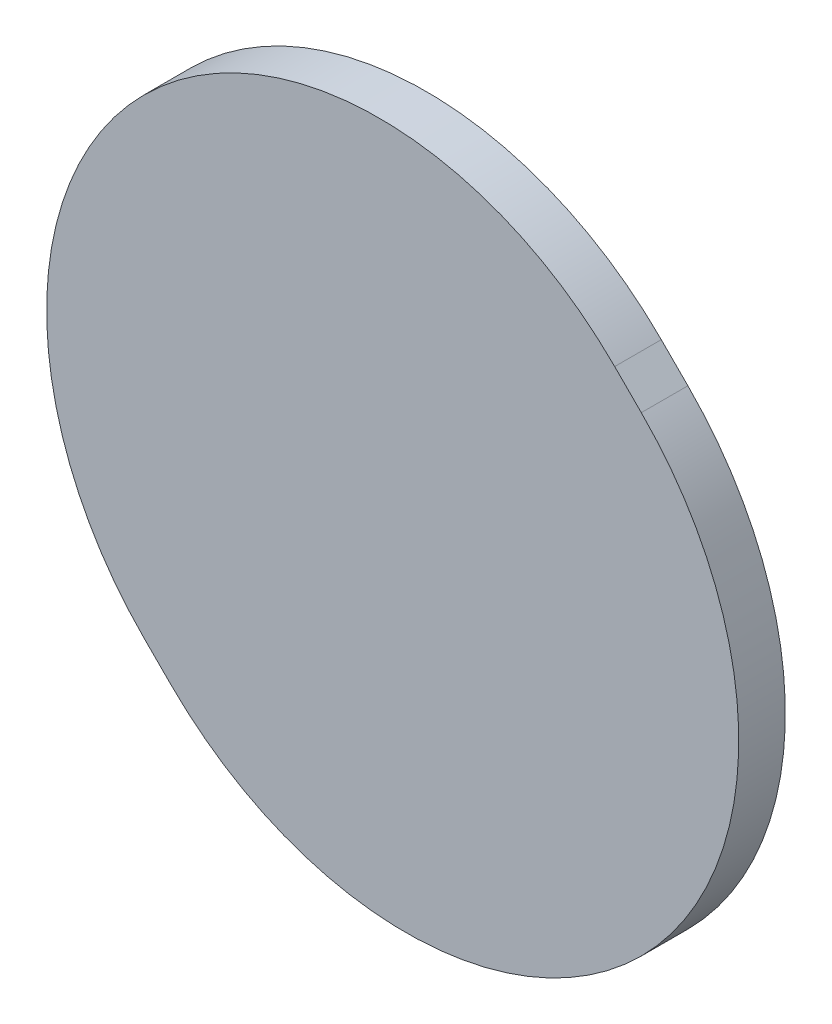
ISO-10303-21;
HEADER;
FILE_DESCRIPTION(('STEP AP214'),'2;1');
FILE_NAME('part.step','',(''),(''),'','','');
FILE_SCHEMA(('AUTOMOTIVE_DESIGN { 1 0 10303 214 1 1 1 1 }'));
ENDSEC;
DATA;
#1=APPLICATION_CONTEXT('core data for automotive mechanical design processes');
#2=APPLICATION_PROTOCOL_DEFINITION('international standard','automotive_design',2000,#1);
#3=PRODUCT_CONTEXT('',#1,'mechanical');
#4=PRODUCT('Part','Part','',(#3));
#5=PRODUCT_RELATED_PRODUCT_CATEGORY('part','',(#4));
#6=PRODUCT_DEFINITION_FORMATION('','',#4);
#7=PRODUCT_DEFINITION_CONTEXT('part definition',#1,'design');
#8=PRODUCT_DEFINITION('design','',#6,#7);
#9=PRODUCT_DEFINITION_SHAPE('','',#8);
#10=(LENGTH_UNIT() NAMED_UNIT(*) SI_UNIT(.MILLI.,.METRE.));
#11=(NAMED_UNIT(*) PLANE_ANGLE_UNIT() SI_UNIT($,.RADIAN.));
#12=(NAMED_UNIT(*) SI_UNIT($,.STERADIAN.) SOLID_ANGLE_UNIT());
#13=UNCERTAINTY_MEASURE_WITH_UNIT(LENGTH_MEASURE(1.E-05),#10,'distance_accuracy_value','');
#14=(GEOMETRIC_REPRESENTATION_CONTEXT(3) GLOBAL_UNCERTAINTY_ASSIGNED_CONTEXT((#13)) GLOBAL_UNIT_ASSIGNED_CONTEXT((#10,
#11,#12)) REPRESENTATION_CONTEXT('',''));
#15=CARTESIAN_POINT('',(0.,0.,0.));
#16=DIRECTION('',(0.,0.,1.));
#17=DIRECTION('',(1.,0.,0.));
#18=AXIS2_PLACEMENT_3D('',#15,#16,#17);
#19=CARTESIAN_POINT('',(96.886776,-97.817223,1.635));
#20=DIRECTION('',(0.,0.,1.));
#21=DIRECTION('',(1.,0.,0.));
#22=AXIS2_PLACEMENT_3D('',#19,#20,#21);
#23=PLANE('',#22);
#24=DIRECTION('',(-0.707106781186548,0.707106781186548,0.));
#25=VECTOR('',#24,1.);
#26=CARTESIAN_POINT('',(96.886776,-97.817223,1.635));
#27=LINE('',#26,#25);
#28=CARTESIAN_POINT('',(96.886776,-97.817223,1.635));
#29=VERTEX_POINT('',#28);
#30=CARTESIAN_POINT('',(96.866776,-97.797223,1.635));
#31=VERTEX_POINT('',#30);
#32=EDGE_CURVE('E87',#29,#31,#27,.T.);
#33=ORIENTED_EDGE('',*,*,#32,.T.);
#34=CARTESIAN_POINT('',(96.6899995,-97.9739995,1.635));
#35=DIRECTION('',(0.,0.,1.));
#36=DIRECTION('',(0.707106781186548,0.707106781186548,0.));
#37=AXIS2_PLACEMENT_3D('',#34,#35,#36);
#38=CIRCLE('',#37,0.249999723809);
#39=CARTESIAN_POINT('',(96.513223,-98.150776,1.635));
#40=VERTEX_POINT('',#39);
#41=EDGE_CURVE('E114',#31,#40,#38,.T.);
#42=ORIENTED_EDGE('',*,*,#41,.T.);
#43=DIRECTION('',(0.707106781186548,-0.707106781186548,0.));
#44=VECTOR('',#43,1.);
#45=CARTESIAN_POINT('',(96.513223,-98.150776,1.635));
#46=LINE('',#45,#44);
#47=CARTESIAN_POINT('',(96.533223,-98.170776,1.635));
#48=VERTEX_POINT('',#47);
#49=EDGE_CURVE('E49',#40,#48,#46,.T.);
#50=ORIENTED_EDGE('',*,*,#49,.T.);
#51=CARTESIAN_POINT('',(96.7099995,-97.9939995,1.635));
#52=DIRECTION('',(0.,0.,1.));
#53=DIRECTION('',(-0.707106781186548,-0.707106781186548,0.));
#54=AXIS2_PLACEMENT_3D('',#51,#52,#53);
#55=CIRCLE('',#54,0.249999723809);
#56=EDGE_CURVE('E11',#48,#29,#55,.T.);
#57=ORIENTED_EDGE('',*,*,#56,.T.);
#58=EDGE_LOOP('',(#33,#42,#50,#57));
#59=FACE_BOUND('',#58,.T.);
#60=ADVANCED_FACE('F17',(#59),#23,.T.);
#61=CARTESIAN_POINT('',(96.886776,-97.817223,1.6));
#62=DIRECTION('',(0.,0.,1.));
#63=DIRECTION('',(1.,0.,0.));
#64=AXIS2_PLACEMENT_3D('',#61,#62,#63);
#65=PLANE('',#64);
#66=CARTESIAN_POINT('',(96.7099995,-97.9939995,1.6));
#67=DIRECTION('',(0.,0.,1.));
#68=DIRECTION('',(-0.707106781186548,-0.707106781186548,0.));
#69=AXIS2_PLACEMENT_3D('',#66,#67,#68);
#70=CIRCLE('',#69,0.249999723809);
#71=CARTESIAN_POINT('',(96.533223,-98.170776,1.6));
#72=VERTEX_POINT('',#71);
#73=CARTESIAN_POINT('',(96.886776,-97.817223,1.6));
#74=VERTEX_POINT('',#73);
#75=EDGE_CURVE('E26',#72,#74,#70,.T.);
#76=ORIENTED_EDGE('',*,*,#75,.F.);
#77=DIRECTION('',(0.707106781186548,-0.707106781186548,0.));
#78=VECTOR('',#77,1.);
#79=CARTESIAN_POINT('',(96.513223,-98.150776,1.6));
#80=LINE('',#79,#78);
#81=CARTESIAN_POINT('',(96.513223,-98.150776,1.6));
#82=VERTEX_POINT('',#81);
#83=EDGE_CURVE('E58',#82,#72,#80,.T.);
#84=ORIENTED_EDGE('',*,*,#83,.F.);
#85=CARTESIAN_POINT('',(96.6899995,-97.9739995,1.6));
#86=DIRECTION('',(0.,0.,1.));
#87=DIRECTION('',(0.707106781186548,0.707106781186548,0.));
#88=AXIS2_PLACEMENT_3D('',#85,#86,#87);
#89=CIRCLE('',#88,0.249999723809);
#90=CARTESIAN_POINT('',(96.866776,-97.797223,1.6));
#91=VERTEX_POINT('',#90);
#92=EDGE_CURVE('E89',#91,#82,#89,.T.);
#93=ORIENTED_EDGE('',*,*,#92,.F.);
#94=DIRECTION('',(-0.707106781186548,0.707106781186548,0.));
#95=VECTOR('',#94,1.);
#96=CARTESIAN_POINT('',(96.886776,-97.817223,1.6));
#97=LINE('',#96,#95);
#98=EDGE_CURVE('E86',#74,#91,#97,.T.);
#99=ORIENTED_EDGE('',*,*,#98,.F.);
#100=EDGE_LOOP('',(#76,#84,#93,#99));
#101=FACE_BOUND('',#100,.T.);
#102=ADVANCED_FACE('F91',(#101),#65,.F.);
#103=CARTESIAN_POINT('',(96.7099995,-97.9939995,1.6));
#104=DIRECTION('',(0.,0.,-1.));
#105=DIRECTION('',(-0.707106781186548,-0.707106781186548,0.));
#106=AXIS2_PLACEMENT_3D('',#103,#104,#105);
#107=CYLINDRICAL_SURFACE('',#106,0.249999723809);
#108=ORIENTED_EDGE('',*,*,#75,.T.);
#109=DIRECTION('',(0.,0.,1.));
#110=VECTOR('',#109,1.);
#111=CARTESIAN_POINT('',(96.886776,-97.817223,1.6));
#112=LINE('',#111,#110);
#113=EDGE_CURVE('E77',#74,#29,#112,.T.);
#114=ORIENTED_EDGE('',*,*,#113,.T.);
#115=ORIENTED_EDGE('',*,*,#56,.F.);
#116=DIRECTION('',(0.,0.,1.));
#117=VECTOR('',#116,1.);
#118=CARTESIAN_POINT('',(96.533223,-98.170776,1.6));
#119=LINE('',#118,#117);
#120=EDGE_CURVE('E79',#72,#48,#119,.T.);
#121=ORIENTED_EDGE('',*,*,#120,.F.);
#122=EDGE_LOOP('',(#108,#114,#115,#121));
#123=FACE_BOUND('',#122,.T.);
#124=ADVANCED_FACE('F76',(#123),#107,.T.);
#125=CARTESIAN_POINT('',(96.513223,-98.150776,1.6));
#126=DIRECTION('',(0.707106781186548,0.707106781186548,0.));
#127=DIRECTION('',(0.,0.,-1.));
#128=AXIS2_PLACEMENT_3D('',#125,#126,#127);
#129=PLANE('',#128);
#130=ORIENTED_EDGE('',*,*,#83,.T.);
#131=ORIENTED_EDGE('',*,*,#120,.T.);
#132=ORIENTED_EDGE('',*,*,#49,.F.);
#133=DIRECTION('',(0.,0.,1.));
#134=VECTOR('',#133,1.);
#135=CARTESIAN_POINT('',(96.513223,-98.150776,1.6));
#136=LINE('',#135,#134);
#137=EDGE_CURVE('E110',#82,#40,#136,.T.);
#138=ORIENTED_EDGE('',*,*,#137,.F.);
#139=EDGE_LOOP('',(#130,#131,#132,#138));
#140=FACE_BOUND('',#139,.T.);
#141=ADVANCED_FACE('F120',(#140),#129,.F.);
#142=CARTESIAN_POINT('',(96.6899995,-97.9739995,1.6));
#143=DIRECTION('',(0.,0.,-1.));
#144=DIRECTION('',(0.707106781186548,0.707106781186548,0.));
#145=AXIS2_PLACEMENT_3D('',#142,#143,#144);
#146=CYLINDRICAL_SURFACE('',#145,0.249999723809);
#147=ORIENTED_EDGE('',*,*,#92,.T.);
#148=ORIENTED_EDGE('',*,*,#137,.T.);
#149=ORIENTED_EDGE('',*,*,#41,.F.);
#150=DIRECTION('',(0.,0.,1.));
#151=VECTOR('',#150,1.);
#152=CARTESIAN_POINT('',(96.866776,-97.797223,1.6));
#153=LINE('',#152,#151);
#154=EDGE_CURVE('E95',#91,#31,#153,.T.);
#155=ORIENTED_EDGE('',*,*,#154,.F.);
#156=EDGE_LOOP('',(#147,#148,#149,#155));
#157=FACE_BOUND('',#156,.T.);
#158=ADVANCED_FACE('F122',(#157),#146,.T.);
#159=CARTESIAN_POINT('',(96.886776,-97.817223,1.6));
#160=DIRECTION('',(-0.707106781186548,-0.707106781186548,0.));
#161=DIRECTION('',(-0.707106781186548,0.707106781186548,0.));
#162=AXIS2_PLACEMENT_3D('',#159,#160,#161);
#163=PLANE('',#162);
#164=ORIENTED_EDGE('',*,*,#98,.T.);
#165=ORIENTED_EDGE('',*,*,#154,.T.);
#166=ORIENTED_EDGE('',*,*,#32,.F.);
#167=ORIENTED_EDGE('',*,*,#113,.F.);
#168=EDGE_LOOP('',(#164,#165,#166,#167));
#169=FACE_BOUND('',#168,.T.);
#170=ADVANCED_FACE('F84',(#169),#163,.F.);
#171=CLOSED_SHELL('',(#60,#102,#124,#141,#158,#170));
#172=MANIFOLD_SOLID_BREP('B1',#171);
#173=ADVANCED_BREP_SHAPE_REPRESENTATION('',(#18,#172),#14);
#174=SHAPE_DEFINITION_REPRESENTATION(#9,#173);
ENDSEC;
END-ISO-10303-21;
